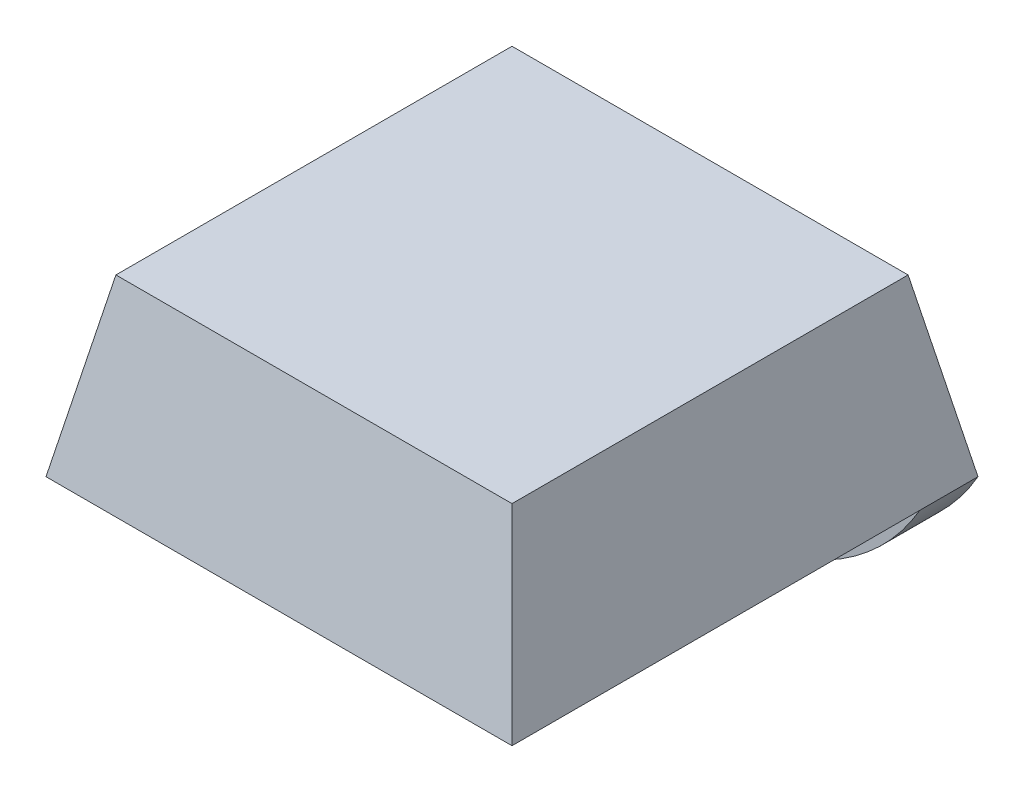
ISO-10303-21;
HEADER;
FILE_DESCRIPTION(('STEP AP214'),'2;1');
FILE_NAME('part.step','',(''),(''),'','','');
FILE_SCHEMA(('AUTOMOTIVE_DESIGN { 1 0 10303 214 1 1 1 1 }'));
ENDSEC;
DATA;
#1=APPLICATION_CONTEXT('core data for automotive mechanical design processes');
#2=APPLICATION_PROTOCOL_DEFINITION('international standard','automotive_design',2000,#1);
#3=PRODUCT_CONTEXT('',#1,'mechanical');
#4=PRODUCT('Part','Part','',(#3));
#5=PRODUCT_RELATED_PRODUCT_CATEGORY('part','',(#4));
#6=PRODUCT_DEFINITION_FORMATION('','',#4);
#7=PRODUCT_DEFINITION_CONTEXT('part definition',#1,'design');
#8=PRODUCT_DEFINITION('design','',#6,#7);
#9=PRODUCT_DEFINITION_SHAPE('','',#8);
#10=(LENGTH_UNIT() NAMED_UNIT(*) SI_UNIT(.MILLI.,.METRE.));
#11=(NAMED_UNIT(*) PLANE_ANGLE_UNIT() SI_UNIT($,.RADIAN.));
#12=(NAMED_UNIT(*) SI_UNIT($,.STERADIAN.) SOLID_ANGLE_UNIT());
#13=UNCERTAINTY_MEASURE_WITH_UNIT(LENGTH_MEASURE(1.E-05),#10,'distance_accuracy_value','');
#14=(GEOMETRIC_REPRESENTATION_CONTEXT(3) GLOBAL_UNCERTAINTY_ASSIGNED_CONTEXT((#13)) GLOBAL_UNIT_ASSIGNED_CONTEXT((#10,
#11,#12)) REPRESENTATION_CONTEXT('',''));
#15=CARTESIAN_POINT('',(0.,0.,0.));
#16=DIRECTION('',(0.,0.,1.));
#17=DIRECTION('',(1.,0.,0.));
#18=AXIS2_PLACEMENT_3D('',#15,#16,#17);
#19=CARTESIAN_POINT('',(0.,3.,0.));
#20=DIRECTION('',(0.,-1.,0.));
#21=DIRECTION('',(0.,0.,-1.));
#22=AXIS2_PLACEMENT_3D('',#19,#20,#21);
#23=PLANE('',#22);
#24=DIRECTION('',(-1.,0.,0.));
#25=VECTOR('',#24,1.);
#26=CARTESIAN_POINT('',(11.,3.,-0.6));
#27=LINE('',#26,#25);
#28=CARTESIAN_POINT('',(7.4,3.,-0.6));
#29=VERTEX_POINT('',#28);
#30=CARTESIAN_POINT('',(0.6,3.,-0.6));
#31=VERTEX_POINT('',#30);
#32=EDGE_CURVE('E188',#29,#31,#27,.T.);
#33=ORIENTED_EDGE('',*,*,#32,.F.);
#34=DIRECTION('',(0.,0.,1.));
#35=VECTOR('',#34,1.);
#36=CARTESIAN_POINT('',(7.4,3.,-8.));
#37=LINE('',#36,#35);
#38=CARTESIAN_POINT('',(7.4,3.,-7.4));
#39=VERTEX_POINT('',#38);
#40=EDGE_CURVE('E168',#39,#29,#37,.T.);
#41=ORIENTED_EDGE('',*,*,#40,.F.);
#42=DIRECTION('',(-1.,0.,0.));
#43=VECTOR('',#42,1.);
#44=CARTESIAN_POINT('',(11.,3.,-7.4));
#45=LINE('',#44,#43);
#46=CARTESIAN_POINT('',(0.599999999999999,3.,-7.4));
#47=VERTEX_POINT('',#46);
#48=EDGE_CURVE('E193',#39,#47,#45,.T.);
#49=ORIENTED_EDGE('',*,*,#48,.T.);
#50=DIRECTION('',(0.,0.,1.));
#51=VECTOR('',#50,1.);
#52=CARTESIAN_POINT('',(0.6,3.,-8.));
#53=LINE('',#52,#51);
#54=EDGE_CURVE('E125',#47,#31,#53,.T.);
#55=ORIENTED_EDGE('',*,*,#54,.T.);
#56=EDGE_LOOP('',(#33,#41,#49,#55));
#57=FACE_BOUND('',#56,.T.);
#58=ADVANCED_FACE('F42',(#57),#23,.F.);
#59=CARTESIAN_POINT('',(8.,0.,-8.));
#60=DIRECTION('',(-0.98058067569092,-0.196116135138184,0.));
#61=DIRECTION('',(0.196116135138184,-0.98058067569092,0.));
#62=AXIS2_PLACEMENT_3D('',#59,#60,#61);
#63=PLANE('',#62);
#64=DIRECTION('',(-0.192450089729875,0.962250448649376,-0.192450089729875));
#65=VECTOR('',#64,1.);
#66=CARTESIAN_POINT('',(7.7037037037037,1.48148148148148,-0.296296296296296));
#67=LINE('',#66,#65);
#68=CARTESIAN_POINT('',(8.,0.,0.));
#69=VERTEX_POINT('',#68);
#70=EDGE_CURVE('E196',#69,#29,#67,.T.);
#71=ORIENTED_EDGE('',*,*,#70,.F.);
#72=DIRECTION('',(0.,0.,-1.));
#73=VECTOR('',#72,1.);
#74=CARTESIAN_POINT('',(8.,0.,0.));
#75=LINE('',#74,#73);
#76=CARTESIAN_POINT('',(8.,0.,-7.));
#77=VERTEX_POINT('',#76);
#78=EDGE_CURVE('E159',#69,#77,#75,.T.);
#79=ORIENTED_EDGE('',*,*,#78,.T.);
#80=DIRECTION('',(0.,0.,1.));
#81=VECTOR('',#80,1.);
#82=CARTESIAN_POINT('',(8.,0.,-8.));
#83=LINE('',#82,#81);
#84=CARTESIAN_POINT('',(8.,0.,-8.));
#85=VERTEX_POINT('',#84);
#86=EDGE_CURVE('E130',#85,#77,#83,.T.);
#87=ORIENTED_EDGE('',*,*,#86,.F.);
#88=DIRECTION('',(0.192450089729875,-0.962250448649376,-0.192450089729875));
#89=VECTOR('',#88,1.);
#90=CARTESIAN_POINT('',(8.,0.,-8.));
#91=LINE('',#90,#89);
#92=EDGE_CURVE('E157',#39,#85,#91,.T.);
#93=ORIENTED_EDGE('',*,*,#92,.F.);
#94=ORIENTED_EDGE('',*,*,#40,.T.);
#95=EDGE_LOOP('',(#71,#79,#87,#93,#94));
#96=FACE_BOUND('',#95,.T.);
#97=ADVANCED_FACE('F225',(#96),#63,.F.);
#98=CARTESIAN_POINT('',(0.,0.,-8.));
#99=DIRECTION('',(0.98058067569092,-0.196116135138184,0.));
#100=DIRECTION('',(0.196116135138184,0.98058067569092,0.));
#101=AXIS2_PLACEMENT_3D('',#98,#99,#100);
#102=PLANE('',#101);
#103=DIRECTION('',(-0.192450089729875,-0.962250448649376,0.192450089729875));
#104=VECTOR('',#103,1.);
#105=CARTESIAN_POINT('',(0.296296296296296,1.48148148148148,-0.296296296296296));
#106=LINE('',#105,#104);
#107=CARTESIAN_POINT('',(0.,0.,0.));
#108=VERTEX_POINT('',#107);
#109=EDGE_CURVE('E163',#31,#108,#106,.T.);
#110=ORIENTED_EDGE('',*,*,#109,.F.);
#111=ORIENTED_EDGE('',*,*,#54,.F.);
#112=DIRECTION('',(0.192450089729875,0.962250448649376,0.192450089729875));
#113=VECTOR('',#112,1.);
#114=CARTESIAN_POINT('',(0.,0.,-8.));
#115=LINE('',#114,#113);
#116=CARTESIAN_POINT('',(0.,0.,-8.));
#117=VERTEX_POINT('',#116);
#118=EDGE_CURVE('E111',#117,#47,#115,.T.);
#119=ORIENTED_EDGE('',*,*,#118,.F.);
#120=DIRECTION('',(0.,0.,1.));
#121=VECTOR('',#120,1.);
#122=CARTESIAN_POINT('',(0.,0.,0.));
#123=LINE('',#122,#121);
#124=CARTESIAN_POINT('',(0.,0.,-7.));
#125=VERTEX_POINT('',#124);
#126=EDGE_CURVE('E104',#117,#125,#123,.T.);
#127=ORIENTED_EDGE('',*,*,#126,.T.);
#128=EDGE_CURVE('E108',#125,#108,#123,.T.);
#129=ORIENTED_EDGE('',*,*,#128,.T.);
#130=EDGE_LOOP('',(#110,#111,#119,#127,#129));
#131=FACE_BOUND('',#130,.T.);
#132=ADVANCED_FACE('F107',(#131),#102,.F.);
#133=CARTESIAN_POINT('',(0.,0.,0.));
#134=DIRECTION('',(0.,-1.,0.));
#135=DIRECTION('',(0.,0.,-1.));
#136=AXIS2_PLACEMENT_3D('',#133,#134,#135);
#137=PLANE('',#136);
#138=DIRECTION('',(-1.,0.,0.));
#139=VECTOR('',#138,1.);
#140=CARTESIAN_POINT('',(0.,0.,-7.));
#141=LINE('',#140,#139);
#142=EDGE_CURVE('E122',#77,#125,#141,.T.);
#143=ORIENTED_EDGE('',*,*,#142,.F.);
#144=ORIENTED_EDGE('',*,*,#78,.F.);
#145=DIRECTION('',(1.,0.,0.));
#146=VECTOR('',#145,1.);
#147=CARTESIAN_POINT('',(0.,0.,0.));
#148=LINE('',#147,#146);
#149=EDGE_CURVE('E114',#108,#69,#148,.T.);
#150=ORIENTED_EDGE('',*,*,#149,.F.);
#151=ORIENTED_EDGE('',*,*,#128,.F.);
#152=EDGE_LOOP('',(#143,#144,#150,#151));
#153=FACE_BOUND('',#152,.T.);
#154=CARTESIAN_POINT('',(4.,0.,-3.75));
#155=DIRECTION('',(0.,-1.,0.));
#156=DIRECTION('',(0.,0.,-1.));
#157=AXIS2_PLACEMENT_3D('',#154,#155,#156);
#158=CIRCLE('',#157,1.8);
#159=CARTESIAN_POINT('',(4.,0.,-5.55));
#160=VERTEX_POINT('',#159);
#161=EDGE_CURVE('E209',#160,#160,#158,.T.);
#162=ORIENTED_EDGE('',*,*,#161,.F.);
#163=EDGE_LOOP('',(#162));
#164=FACE_BOUND('',#163,.T.);
#165=ADVANCED_FACE('F119',(#153,#164),#137,.T.);
#166=CARTESIAN_POINT('',(11.,3.,-7.4));
#167=DIRECTION('',(0.,0.196116135138184,-0.98058067569092));
#168=DIRECTION('',(0.,0.98058067569092,0.196116135138184));
#169=AXIS2_PLACEMENT_3D('',#166,#167,#168);
#170=PLANE('',#169);
#171=ORIENTED_EDGE('',*,*,#92,.T.);
#172=DIRECTION('',(-1.,0.,0.));
#173=VECTOR('',#172,1.);
#174=CARTESIAN_POINT('',(0.,0.,-8.));
#175=LINE('',#174,#173);
#176=EDGE_CURVE('E149',#85,#117,#175,.T.);
#177=ORIENTED_EDGE('',*,*,#176,.T.);
#178=ORIENTED_EDGE('',*,*,#118,.T.);
#179=ORIENTED_EDGE('',*,*,#48,.F.);
#180=EDGE_LOOP('',(#171,#177,#178,#179));
#181=FACE_BOUND('',#180,.T.);
#182=ADVANCED_FACE('F154',(#181),#170,.T.);
#183=CARTESIAN_POINT('',(11.,0.,0.));
#184=DIRECTION('',(0.,0.196116135138184,0.98058067569092));
#185=DIRECTION('',(0.,-0.98058067569092,0.196116135138184));
#186=AXIS2_PLACEMENT_3D('',#183,#184,#185);
#187=PLANE('',#186);
#188=ORIENTED_EDGE('',*,*,#70,.T.);
#189=ORIENTED_EDGE('',*,*,#32,.T.);
#190=ORIENTED_EDGE('',*,*,#109,.T.);
#191=ORIENTED_EDGE('',*,*,#149,.T.);
#192=EDGE_LOOP('',(#188,#189,#190,#191));
#193=FACE_BOUND('',#192,.T.);
#194=ADVANCED_FACE('F185',(#193),#187,.T.);
#195=CARTESIAN_POINT('',(4.,0.8,-3.75));
#196=DIRECTION('',(0.,-1.,0.));
#197=DIRECTION('',(0.,0.,-1.));
#198=AXIS2_PLACEMENT_3D('',#195,#196,#197);
#199=CYLINDRICAL_SURFACE('',#198,1.8);
#200=CARTESIAN_POINT('',(4.,0.8,-3.75));
#201=DIRECTION('',(0.,-1.,0.));
#202=DIRECTION('',(0.,0.,-1.));
#203=AXIS2_PLACEMENT_3D('',#200,#201,#202);
#204=CIRCLE('',#203,1.8);
#205=CARTESIAN_POINT('',(4.,0.8,-5.55));
#206=VERTEX_POINT('',#205);
#207=EDGE_CURVE('E206',#206,#206,#204,.T.);
#208=ORIENTED_EDGE('',*,*,#207,.F.);
#209=EDGE_LOOP('',(#208));
#210=FACE_BOUND('',#209,.T.);
#211=ORIENTED_EDGE('',*,*,#161,.T.);
#212=EDGE_LOOP('',(#211));
#213=FACE_BOUND('',#212,.T.);
#214=ADVANCED_FACE('F253',(#210,#213),#199,.F.);
#215=CARTESIAN_POINT('',(4.,0.8,-3.75));
#216=DIRECTION('',(0.,-1.,0.));
#217=DIRECTION('',(0.,0.,-1.));
#218=AXIS2_PLACEMENT_3D('',#215,#216,#217);
#219=PLANE('',#218);
#220=ORIENTED_EDGE('',*,*,#207,.T.);
#221=EDGE_LOOP('',(#220));
#222=FACE_BOUND('',#221,.T.);
#223=ADVANCED_FACE('F250',(#222),#219,.T.);
#224=CARTESIAN_POINT('',(0.,-2.,-8.));
#225=DIRECTION('',(0.,0.,1.));
#226=DIRECTION('',(1.,0.,0.));
#227=AXIS2_PLACEMENT_3D('',#224,#225,#226);
#228=PLANE('',#227);
#229=ORIENTED_EDGE('',*,*,#176,.F.);
#230=CARTESIAN_POINT('',(4.53589838486225,2.,-8.));
#231=DIRECTION('',(0.,0.,1.));
#232=DIRECTION('',(1.,0.,0.));
#233=AXIS2_PLACEMENT_3D('',#230,#231,#232);
#234=CIRCLE('',#233,4.);
#235=CARTESIAN_POINT('',(4.53589838486225,-2.,-8.));
#236=VERTEX_POINT('',#235);
#237=EDGE_CURVE('E11',#85,#236,#234,.F.);
#238=ORIENTED_EDGE('',*,*,#237,.T.);
#239=DIRECTION('',(1.,0.,0.));
#240=VECTOR('',#239,1.);
#241=CARTESIAN_POINT('',(0.,-2.,-8.));
#242=LINE('',#241,#240);
#243=CARTESIAN_POINT('',(3.46410161513775,-2.,-8.));
#244=VERTEX_POINT('',#243);
#245=EDGE_CURVE('E129',#244,#236,#242,.T.);
#246=ORIENTED_EDGE('',*,*,#245,.F.);
#247=CARTESIAN_POINT('',(3.46410161513775,2.,-8.));
#248=DIRECTION('',(0.,0.,1.));
#249=DIRECTION('',(1.,0.,0.));
#250=AXIS2_PLACEMENT_3D('',#247,#248,#249);
#251=CIRCLE('',#250,4.);
#252=EDGE_CURVE('E51',#244,#117,#251,.F.);
#253=ORIENTED_EDGE('',*,*,#252,.T.);
#254=EDGE_LOOP('',(#229,#238,#246,#253));
#255=FACE_BOUND('',#254,.T.);
#256=ADVANCED_FACE('F148',(#255),#228,.F.);
#257=CARTESIAN_POINT('',(0.,-2.,-7.));
#258=DIRECTION('',(0.,0.,-1.));
#259=DIRECTION('',(-1.,0.,0.));
#260=AXIS2_PLACEMENT_3D('',#257,#258,#259);
#261=PLANE('',#260);
#262=DIRECTION('',(-1.,0.,0.));
#263=VECTOR('',#262,1.);
#264=CARTESIAN_POINT('',(0.,-2.,-7.));
#265=LINE('',#264,#263);
#266=CARTESIAN_POINT('',(4.53589838486225,-2.,-7.));
#267=VERTEX_POINT('',#266);
#268=CARTESIAN_POINT('',(3.46410161513775,-2.,-7.));
#269=VERTEX_POINT('',#268);
#270=EDGE_CURVE('E213',#267,#269,#265,.T.);
#271=ORIENTED_EDGE('',*,*,#270,.F.);
#272=CARTESIAN_POINT('',(4.53589838486225,2.,-7.));
#273=DIRECTION('',(0.,0.,-1.));
#274=DIRECTION('',(-1.,0.,0.));
#275=AXIS2_PLACEMENT_3D('',#272,#273,#274);
#276=CIRCLE('',#275,4.);
#277=EDGE_CURVE('E66',#267,#77,#276,.F.);
#278=ORIENTED_EDGE('',*,*,#277,.T.);
#279=ORIENTED_EDGE('',*,*,#142,.T.);
#280=CARTESIAN_POINT('',(3.46410161513775,2.,-7.));
#281=DIRECTION('',(0.,0.,-1.));
#282=DIRECTION('',(-1.,0.,0.));
#283=AXIS2_PLACEMENT_3D('',#280,#281,#282);
#284=CIRCLE('',#283,4.);
#285=EDGE_CURVE('E58',#125,#269,#284,.F.);
#286=ORIENTED_EDGE('',*,*,#285,.T.);
#287=EDGE_LOOP('',(#271,#278,#279,#286));
#288=FACE_BOUND('',#287,.T.);
#289=ADVANCED_FACE('F127',(#288),#261,.F.);
#290=CARTESIAN_POINT('',(0.,-2.,0.));
#291=DIRECTION('',(0.,1.,0.));
#292=DIRECTION('',(0.,0.,1.));
#293=AXIS2_PLACEMENT_3D('',#290,#291,#292);
#294=PLANE('',#293);
#295=ORIENTED_EDGE('',*,*,#245,.T.);
#296=DIRECTION('',(0.,0.,1.));
#297=VECTOR('',#296,1.);
#298=CARTESIAN_POINT('',(4.53589838486225,-2.,0.));
#299=LINE('',#298,#297);
#300=EDGE_CURVE('E136',#236,#267,#299,.T.);
#301=ORIENTED_EDGE('',*,*,#300,.T.);
#302=ORIENTED_EDGE('',*,*,#270,.T.);
#303=DIRECTION('',(0.,0.,-1.));
#304=VECTOR('',#303,1.);
#305=CARTESIAN_POINT('',(3.46410161513775,-2.,0.));
#306=LINE('',#305,#304);
#307=EDGE_CURVE('E134',#269,#244,#306,.T.);
#308=ORIENTED_EDGE('',*,*,#307,.T.);
#309=EDGE_LOOP('',(#295,#301,#302,#308));
#310=FACE_BOUND('',#309,.T.);
#311=ADVANCED_FACE('F222',(#310),#294,.F.);
#312=CARTESIAN_POINT('',(4.53589838486225,2.,-8.));
#313=DIRECTION('',(0.,0.,1.));
#314=DIRECTION('',(1.,0.,0.));
#315=AXIS2_PLACEMENT_3D('',#312,#313,#314);
#316=CYLINDRICAL_SURFACE('',#315,4.);
#317=ORIENTED_EDGE('',*,*,#237,.F.);
#318=ORIENTED_EDGE('',*,*,#86,.T.);
#319=ORIENTED_EDGE('',*,*,#277,.F.);
#320=ORIENTED_EDGE('',*,*,#300,.F.);
#321=EDGE_LOOP('',(#317,#318,#319,#320));
#322=FACE_BOUND('',#321,.T.);
#323=ADVANCED_FACE('F223',(#322),#316,.T.);
#324=CARTESIAN_POINT('',(3.46410161513775,2.,-8.));
#325=DIRECTION('',(0.,0.,-1.));
#326=DIRECTION('',(-1.,0.,0.));
#327=AXIS2_PLACEMENT_3D('',#324,#325,#326);
#328=CYLINDRICAL_SURFACE('',#327,4.);
#329=ORIENTED_EDGE('',*,*,#285,.F.);
#330=ORIENTED_EDGE('',*,*,#126,.F.);
#331=ORIENTED_EDGE('',*,*,#252,.F.);
#332=ORIENTED_EDGE('',*,*,#307,.F.);
#333=EDGE_LOOP('',(#329,#330,#331,#332));
#334=FACE_BOUND('',#333,.T.);
#335=ADVANCED_FACE('F44',(#334),#328,.T.);
#336=CLOSED_SHELL('',(#58,#97,#132,#165,#182,#194,#214,#223,#256,#289,#311,#323,#335));
#337=MANIFOLD_SOLID_BREP('B2',#336);
#338=ADVANCED_BREP_SHAPE_REPRESENTATION('',(#18,#337),#14);
#339=SHAPE_DEFINITION_REPRESENTATION(#9,#338);
ENDSEC;
END-ISO-10303-21;
